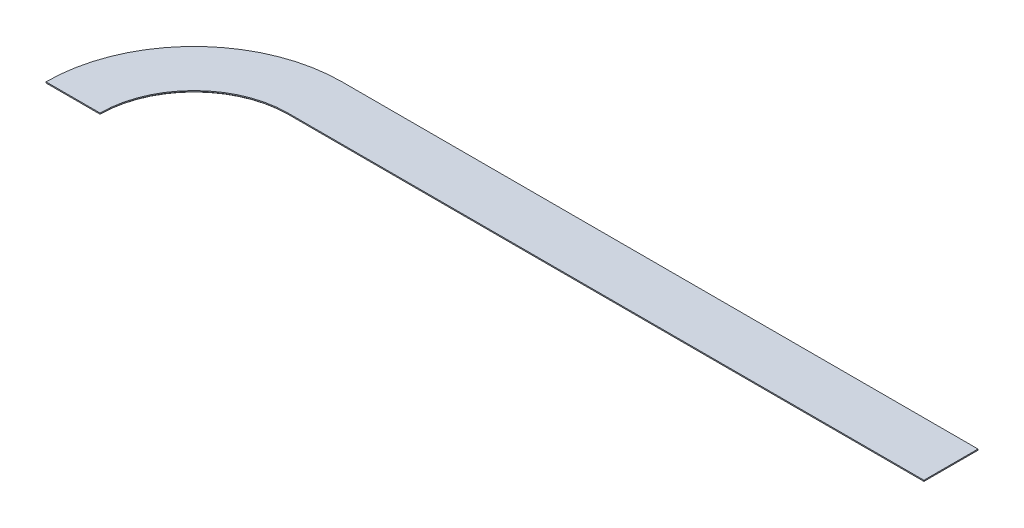
ISO-10303-21;
HEADER;
FILE_DESCRIPTION(('STEP AP214'),'2;1');
FILE_NAME('part.step','',(''),(''),'','','');
FILE_SCHEMA(('AUTOMOTIVE_DESIGN { 1 0 10303 214 1 1 1 1 }'));
ENDSEC;
DATA;
#1=APPLICATION_CONTEXT('core data for automotive mechanical design processes');
#2=APPLICATION_PROTOCOL_DEFINITION('international standard','automotive_design',2000,#1);
#3=PRODUCT_CONTEXT('',#1,'mechanical');
#4=PRODUCT('Part','Part','',(#3));
#5=PRODUCT_RELATED_PRODUCT_CATEGORY('part','',(#4));
#6=PRODUCT_DEFINITION_FORMATION('','',#4);
#7=PRODUCT_DEFINITION_CONTEXT('part definition',#1,'design');
#8=PRODUCT_DEFINITION('design','',#6,#7);
#9=PRODUCT_DEFINITION_SHAPE('','',#8);
#10=(LENGTH_UNIT() NAMED_UNIT(*) SI_UNIT(.MILLI.,.METRE.));
#11=(NAMED_UNIT(*) PLANE_ANGLE_UNIT() SI_UNIT($,.RADIAN.));
#12=(NAMED_UNIT(*) SI_UNIT($,.STERADIAN.) SOLID_ANGLE_UNIT());
#13=UNCERTAINTY_MEASURE_WITH_UNIT(LENGTH_MEASURE(1.E-05),#10,'distance_accuracy_value','');
#14=(GEOMETRIC_REPRESENTATION_CONTEXT(3) GLOBAL_UNCERTAINTY_ASSIGNED_CONTEXT((#13)) GLOBAL_UNIT_ASSIGNED_CONTEXT((#10,
#11,#12)) REPRESENTATION_CONTEXT('',''));
#15=CARTESIAN_POINT('',(0.,0.,0.));
#16=DIRECTION('',(0.,0.,1.));
#17=DIRECTION('',(1.,0.,0.));
#18=AXIS2_PLACEMENT_3D('',#15,#16,#17);
#19=CARTESIAN_POINT('',(-260.,-1088.5,1915.));
#20=DIRECTION('',(0.,-1.,0.));
#21=DIRECTION('',(0.,0.,1.));
#22=AXIS2_PLACEMENT_3D('',#19,#20,#21);
#23=PLANE('',#22);
#24=DIRECTION('',(-1.,7.842116600946E-11,-7.84208623432E-11));
#25=VECTOR('',#24,1.);
#26=CARTESIAN_POINT('',(688.3,-1088.5,830.3));
#27=LINE('',#26,#25);
#28=CARTESIAN_POINT('',(688.3,-1088.5,830.3));
#29=VERTEX_POINT('',#28);
#30=CARTESIAN_POINT('',(-76.,-1088.5,830.29999964));
#31=VERTEX_POINT('',#30);
#32=EDGE_CURVE('E11',#29,#31,#27,.T.);
#33=ORIENTED_EDGE('',*,*,#32,.T.);
#34=CARTESIAN_POINT('',(-76.,-1088.5,944.));
#35=DIRECTION('',(0.,1.,0.));
#36=DIRECTION('',(0.,0.,-1.));
#37=AXIS2_PLACEMENT_3D('',#34,#35,#36);
#38=CIRCLE('',#37,113.7000003596);
#39=CARTESIAN_POINT('',(-189.69784554588,-1088.5,943.2999999989));
#40=VERTEX_POINT('',#39);
#41=EDGE_CURVE('E27',#31,#40,#38,.T.);
#42=ORIENTED_EDGE('',*,*,#41,.T.);
#43=DIRECTION('',(-1.,6.131596345888E-09,3.37320483520896E-11));
#44=VECTOR('',#43,1.);
#45=CARTESIAN_POINT('',(-189.69784530615,-1088.49999994006,943.2999999996));
#46=LINE('',#45,#44);
#47=CARTESIAN_POINT('',(-253.298617256059,-1088.49999955009,943.3000000018));
#48=VERTEX_POINT('',#47);
#49=EDGE_CURVE('E93',#40,#48,#46,.T.);
#50=ORIENTED_EDGE('',*,*,#49,.T.);
#51=CARTESIAN_POINT('',(-76.,-1088.5,944.));
#52=DIRECTION('',(0.,-1.,0.));
#53=DIRECTION('',(-0.999992206181064,0.,-0.00394811057703186));
#54=AXIS2_PLACEMENT_3D('',#51,#52,#53);
#55=CIRCLE('',#54,177.2999973005);
#56=CARTESIAN_POINT('',(-75.9999999999,-1088.49999955009,766.70000045));
#57=VERTEX_POINT('',#56);
#58=EDGE_CURVE('E84',#48,#57,#55,.T.);
#59=ORIENTED_EDGE('',*,*,#58,.T.);
#60=DIRECTION('',(1.,-5.886522143537E-10,-5.88652685408E-10));
#61=VECTOR('',#60,1.);
#62=CARTESIAN_POINT('',(-75.9999999999,-1088.49999955009,766.70000045));
#63=LINE('',#62,#61);
#64=CARTESIAN_POINT('',(688.3,-1088.5,766.7));
#65=VERTEX_POINT('',#64);
#66=EDGE_CURVE('E78',#57,#65,#63,.T.);
#67=ORIENTED_EDGE('',*,*,#66,.T.);
#68=DIRECTION('',(0.,0.,1.));
#69=VECTOR('',#68,1.);
#70=CARTESIAN_POINT('',(688.3,-1088.5,766.7));
#71=LINE('',#70,#69);
#72=EDGE_CURVE('E112',#65,#29,#71,.T.);
#73=ORIENTED_EDGE('',*,*,#72,.T.);
#74=EDGE_LOOP('',(#33,#42,#50,#59,#67,#73));
#75=FACE_BOUND('',#74,.T.);
#76=ADVANCED_FACE('F17',(#75),#23,.T.);
#77=CARTESIAN_POINT('',(688.65,-1088.15,798.5));
#78=DIRECTION('',(0.707106781186498,-0.707106781186598,0.));
#79=DIRECTION('',(0.,0.,-1.));
#80=AXIS2_PLACEMENT_3D('',#77,#78,#79);
#81=PLANE('',#80);
#82=DIRECTION('',(-0.577350269189493,-0.577350269189493,0.577350269189892));
#83=VECTOR('',#82,1.);
#84=CARTESIAN_POINT('',(689.,-1087.8,766.));
#85=LINE('',#84,#83);
#86=CARTESIAN_POINT('',(689.,-1087.8,766.));
#87=VERTEX_POINT('',#86);
#88=EDGE_CURVE('E114',#87,#65,#85,.T.);
#89=ORIENTED_EDGE('',*,*,#88,.F.);
#90=DIRECTION('',(0.,0.,1.));
#91=VECTOR('',#90,1.);
#92=CARTESIAN_POINT('',(689.,-1087.8,766.));
#93=LINE('',#92,#91);
#94=CARTESIAN_POINT('',(689.,-1087.8,831.));
#95=VERTEX_POINT('',#94);
#96=EDGE_CURVE('E21',#87,#95,#93,.T.);
#97=ORIENTED_EDGE('',*,*,#96,.T.);
#98=DIRECTION('',(-0.577350269189693,-0.577350269189693,-0.577350269189492));
#99=VECTOR('',#98,1.);
#100=CARTESIAN_POINT('',(689.,-1087.8,831.));
#101=LINE('',#100,#99);
#102=EDGE_CURVE('E128',#95,#29,#101,.T.);
#103=ORIENTED_EDGE('',*,*,#102,.T.);
#104=ORIENTED_EDGE('',*,*,#72,.F.);
#105=EDGE_LOOP('',(#89,#97,#103,#104));
#106=FACE_BOUND('',#105,.T.);
#107=ADVANCED_FACE('F207',(#106),#81,.T.);
#108=CARTESIAN_POINT('',(306.5,-1088.15,830.65));
#109=DIRECTION('',(0.,-0.707106781186598,0.707106781186498));
#110=DIRECTION('',(1.,0.,0.));
#111=AXIS2_PLACEMENT_3D('',#108,#109,#110);
#112=PLANE('',#111);
#113=ORIENTED_EDGE('',*,*,#102,.F.);
#114=DIRECTION('',(-1.,5.84002560182E-11,-5.839996257101E-11));
#115=VECTOR('',#114,1.);
#116=CARTESIAN_POINT('',(689.,-1087.8,831.));
#117=LINE('',#116,#115);
#118=CARTESIAN_POINT('',(-76.,-1087.7999996426,831.));
#119=VERTEX_POINT('',#118);
#120=EDGE_CURVE('E131',#95,#119,#117,.T.);
#121=ORIENTED_EDGE('',*,*,#120,.T.);
#122=DIRECTION('',(-6.06934940828998E-11,0.707106765770697,0.707106796602397));
#123=VECTOR('',#122,1.);
#124=CARTESIAN_POINT('',(-75.9999999998,-1088.49999994006,830.29999994));
#125=LINE('',#124,#123);
#126=EDGE_CURVE('E167',#31,#119,#125,.T.);
#127=ORIENTED_EDGE('',*,*,#126,.F.);
#128=ORIENTED_EDGE('',*,*,#32,.F.);
#129=EDGE_LOOP('',(#113,#121,#127,#128));
#130=FACE_BOUND('',#129,.T.);
#131=ADVANCED_FACE('F206',(#130),#112,.T.);
#132=CARTESIAN_POINT('',(-76.,-1088.14999982135,944.));
#133=DIRECTION('',(0.,-1.,0.));
#134=DIRECTION('',(1.,0.,0.));
#135=AXIS2_PLACEMENT_3D('',#132,#133,#134);
#136=CONICAL_SURFACE('',#135,113.3500001799,0.785398164978743);
#137=CARTESIAN_POINT('',(-189.00000004467,-1087.79999995532,944.));
#138=CARTESIAN_POINT('',(-189.07734823264,-1087.87734814304,943.9226518123));
#139=CARTESIAN_POINT('',(-189.23217213923,-1088.03233051541,943.7676694974));
#140=CARTESIAN_POINT('',(-189.46478494972,-1088.26566046592,943.5343395563));
#141=CARTESIAN_POINT('',(-189.62011625658,-1088.42179086558,943.3782090741));
#142=CARTESIAN_POINT('',(-189.69784530615,-1088.49999994006,943.2999999996));
#143=(BOUNDED_CURVE() B_SPLINE_CURVE(3,(#137,#138,#139,#140,#141,#142),.UNSPECIFIED.,.F.,
.F.) B_SPLINE_CURVE_WITH_KNOTS((4,1,1,4),(0.,0.3333333333333,0.6666666666667,1.),
.UNSPECIFIED.) CURVE() GEOMETRIC_REPRESENTATION_ITEM() RATIONAL_B_SPLINE_CURVE((1.,1.,1.,1.,1.,1.)) REPRESENTATION_ITEM(''));
#144=CARTESIAN_POINT('',(-189.,-1087.7999996426,944.));
#145=VERTEX_POINT('',#144);
#146=EDGE_CURVE('E138',#145,#40,#143,.T.);
#147=ORIENTED_EDGE('',*,*,#146,.T.);
#148=ORIENTED_EDGE('',*,*,#41,.F.);
#149=ORIENTED_EDGE('',*,*,#126,.T.);
#150=CARTESIAN_POINT('',(-76.,-1087.7999996426,944.));
#151=DIRECTION('',(0.,1.,0.));
#152=DIRECTION('',(0.,0.,-1.));
#153=AXIS2_PLACEMENT_3D('',#150,#151,#152);
#154=CIRCLE('',#153,113.);
#155=EDGE_CURVE('E49',#119,#145,#154,.T.);
#156=ORIENTED_EDGE('',*,*,#155,.T.);
#157=EDGE_LOOP('',(#147,#148,#149,#156));
#158=FACE_BOUND('',#157,.T.);
#159=ADVANCED_FACE('F215',(#158),#136,.F.);
#160=CARTESIAN_POINT('',(-76.,-1088.5,944.));
#161=DIRECTION('',(0.,-1.,0.));
#162=DIRECTION('',(1.,0.,0.));
#163=AXIS2_PLACEMENT_3D('',#160,#161,#162);
#164=CYLINDRICAL_SURFACE('',#163,113.);
#165=DIRECTION('',(-1.353747929547E-10,1.,3.43661329404277E-08));
#166=VECTOR('',#165,1.);
#167=CARTESIAN_POINT('',(-75.9999999998,-1087.79999995532,830.999999955));
#168=LINE('',#167,#166);
#169=CARTESIAN_POINT('',(-76.,-1086.5,831.));
#170=VERTEX_POINT('',#169);
#171=EDGE_CURVE('E141',#119,#170,#168,.T.);
#172=ORIENTED_EDGE('',*,*,#171,.T.);
#173=CARTESIAN_POINT('',(-76.,-1086.5,944.));
#174=DIRECTION('',(0.,1.,0.));
#175=DIRECTION('',(0.,0.,-1.));
#176=AXIS2_PLACEMENT_3D('',#173,#174,#175);
#177=CIRCLE('',#176,113.);
#178=CARTESIAN_POINT('',(-189.,-1086.5,944.));
#179=VERTEX_POINT('',#178);
#180=EDGE_CURVE('E139',#170,#179,#177,.T.);
#181=ORIENTED_EDGE('',*,*,#180,.T.);
#182=DIRECTION('',(3.436520383033E-08,1.,0.));
#183=VECTOR('',#182,1.);
#184=CARTESIAN_POINT('',(-189.00000004467,-1087.79999995532,944.));
#185=LINE('',#184,#183);
#186=EDGE_CURVE('E57',#145,#179,#185,.T.);
#187=ORIENTED_EDGE('',*,*,#186,.F.);
#188=ORIENTED_EDGE('',*,*,#155,.F.);
#189=EDGE_LOOP('',(#172,#181,#187,#188));
#190=FACE_BOUND('',#189,.T.);
#191=ADVANCED_FACE('F176',(#190),#164,.F.);
#192=CARTESIAN_POINT('',(-189.,-1088.5,944.));
#193=DIRECTION('',(0.,0.,1.));
#194=DIRECTION('',(0.,-1.,0.));
#195=AXIS2_PLACEMENT_3D('',#192,#193,#194);
#196=PLANE('',#195);
#197=ORIENTED_EDGE('',*,*,#186,.T.);
#198=DIRECTION('',(-1.,0.,0.));
#199=VECTOR('',#198,1.);
#200=CARTESIAN_POINT('',(-189.,-1086.5,944.));
#201=LINE('',#200,#199);
#202=CARTESIAN_POINT('',(-254.,-1086.5,944.));
#203=VERTEX_POINT('',#202);
#204=EDGE_CURVE('E102',#179,#203,#201,.T.);
#205=ORIENTED_EDGE('',*,*,#204,.T.);
#206=DIRECTION('',(-2.60588194709591E-07,0.999999999999966,0.));
#207=VECTOR('',#206,1.);
#208=CARTESIAN_POINT('',(-253.999999661235,-1087.79999966124,944.));
#209=LINE('',#208,#207);
#210=CARTESIAN_POINT('',(-253.999999661235,-1087.79999966124,944.));
#211=VERTEX_POINT('',#210);
#212=EDGE_CURVE('E162',#211,#203,#209,.T.);
#213=ORIENTED_EDGE('',*,*,#212,.F.);
#214=DIRECTION('',(-1.,4.52445473843E-09,0.));
#215=VECTOR('',#214,1.);
#216=CARTESIAN_POINT('',(-189.00000004467,-1087.79999995532,944.));
#217=LINE('',#216,#215);
#218=EDGE_CURVE('E101',#145,#211,#217,.T.);
#219=ORIENTED_EDGE('',*,*,#218,.F.);
#220=EDGE_LOOP('',(#197,#205,#213,#219));
#221=FACE_BOUND('',#220,.T.);
#222=ADVANCED_FACE('F192',(#221),#196,.T.);
#223=CARTESIAN_POINT('',(-221.4989159188,-1088.15,943.65));
#224=DIRECTION('',(0.,-0.707106781186598,0.707106781186498));
#225=DIRECTION('',(1.,0.,0.));
#226=AXIS2_PLACEMENT_3D('',#223,#224,#225);
#227=PLANE('',#226);
#228=CARTESIAN_POINT('',(-253.999999661235,-1087.79999966124,944.));
#229=CARTESIAN_POINT('',(-253.921947054783,-1087.87805226888,943.9219473924));
#230=CARTESIAN_POINT('',(-253.765920471539,-1088.03397337613,943.7660267222));
#231=CARTESIAN_POINT('',(-253.532127774385,-1088.26730539899,943.532694765));
#232=CARTESIAN_POINT('',(-253.376427496957,-1088.4224959074,943.3775036445));
#233=CARTESIAN_POINT('',(-253.298617256059,-1088.49999955009,943.3000000018));
#234=(BOUNDED_CURVE() B_SPLINE_CURVE(3,(#228,#229,#230,#231,#232,#233),.UNSPECIFIED.,.F.,
.F.) B_SPLINE_CURVE_WITH_KNOTS((4,1,1,4),(0.,0.3333333333333,0.6666666666667,1.),
.UNSPECIFIED.) CURVE() GEOMETRIC_REPRESENTATION_ITEM() RATIONAL_B_SPLINE_CURVE((1.,1.,1.,1.,1.,1.)) REPRESENTATION_ITEM(''));
#235=EDGE_CURVE('E89',#211,#48,#234,.T.);
#236=ORIENTED_EDGE('',*,*,#235,.T.);
#237=ORIENTED_EDGE('',*,*,#49,.F.);
#238=ORIENTED_EDGE('',*,*,#146,.F.);
#239=ORIENTED_EDGE('',*,*,#218,.T.);
#240=EDGE_LOOP('',(#236,#237,#238,#239));
#241=FACE_BOUND('',#240,.T.);
#242=ADVANCED_FACE('F99',(#241),#227,.T.);
#243=CARTESIAN_POINT('',(-76.,-1088.14999864469,944.));
#244=DIRECTION('',(0.,1.,0.));
#245=DIRECTION('',(1.,0.,0.));
#246=AXIS2_PLACEMENT_3D('',#243,#244,#245);
#247=CONICAL_SURFACE('',#246,177.6499986505,0.785398155784522);
#248=ORIENTED_EDGE('',*,*,#235,.F.);
#249=CARTESIAN_POINT('',(-76.,-1087.7999972899,944.));
#250=DIRECTION('',(0.,-1.,0.));
#251=DIRECTION('',(-1.,0.,0.));
#252=AXIS2_PLACEMENT_3D('',#249,#250,#251);
#253=CIRCLE('',#252,178.);
#254=CARTESIAN_POINT('',(-75.9999999999,-1087.79999966124,766.000000339));
#255=VERTEX_POINT('',#254);
#256=EDGE_CURVE('E106',#211,#255,#253,.T.);
#257=ORIENTED_EDGE('',*,*,#256,.T.);
#258=DIRECTION('',(-1.88339319386797E-11,0.707106668913489,-0.707106893459589));
#259=VECTOR('',#258,1.);
#260=CARTESIAN_POINT('',(-75.9999999999,-1088.49999955009,766.70000045));
#261=LINE('',#260,#259);
#262=EDGE_CURVE('E91',#57,#255,#261,.T.);
#263=ORIENTED_EDGE('',*,*,#262,.F.);
#264=ORIENTED_EDGE('',*,*,#58,.F.);
#265=EDGE_LOOP('',(#248,#257,#263,#264));
#266=FACE_BOUND('',#265,.T.);
#267=ADVANCED_FACE('F86',(#266),#247,.T.);
#268=CARTESIAN_POINT('',(306.5,-1088.15,766.35));
#269=DIRECTION('',(0.,-0.707106781186698,-0.707106781186398));
#270=DIRECTION('',(1.,0.,0.));
#271=AXIS2_PLACEMENT_3D('',#268,#269,#270);
#272=PLANE('',#271);
#273=ORIENTED_EDGE('',*,*,#88,.T.);
#274=ORIENTED_EDGE('',*,*,#66,.F.);
#275=ORIENTED_EDGE('',*,*,#262,.T.);
#276=DIRECTION('',(1.,-4.428266877371E-10,-4.42826728663E-10));
#277=VECTOR('',#276,1.);
#278=CARTESIAN_POINT('',(-75.9999999999,-1087.79999966124,766.000000339));
#279=LINE('',#278,#277);
#280=EDGE_CURVE('E125',#255,#87,#279,.T.);
#281=ORIENTED_EDGE('',*,*,#280,.T.);
#282=EDGE_LOOP('',(#273,#274,#275,#281));
#283=FACE_BOUND('',#282,.T.);
#284=ADVANCED_FACE('F234',(#283),#272,.T.);
#285=CARTESIAN_POINT('',(-76.,-1088.5,766.));
#286=DIRECTION('',(0.,0.,-1.));
#287=DIRECTION('',(1.,0.,0.));
#288=AXIS2_PLACEMENT_3D('',#285,#286,#287);
#289=PLANE('',#288);
#290=DIRECTION('',(-4.36382667739086E-11,0.999999999999966,-2.60586565987424E-07));
#291=VECTOR('',#290,1.);
#292=CARTESIAN_POINT('',(-75.9999999999,-1087.79999966124,766.000000339));
#293=LINE('',#292,#291);
#294=CARTESIAN_POINT('',(-76.,-1086.5,766.));
#295=VERTEX_POINT('',#294);
#296=EDGE_CURVE('E127',#255,#295,#293,.T.);
#297=ORIENTED_EDGE('',*,*,#296,.T.);
#298=DIRECTION('',(1.,0.,0.));
#299=VECTOR('',#298,1.);
#300=CARTESIAN_POINT('',(-76.,-1086.5,766.));
#301=LINE('',#300,#299);
#302=CARTESIAN_POINT('',(689.,-1086.5,766.));
#303=VERTEX_POINT('',#302);
#304=EDGE_CURVE('E135',#295,#303,#301,.T.);
#305=ORIENTED_EDGE('',*,*,#304,.T.);
#306=DIRECTION('',(0.,1.,0.));
#307=VECTOR('',#306,1.);
#308=CARTESIAN_POINT('',(689.,-1087.8,766.));
#309=LINE('',#308,#307);
#310=EDGE_CURVE('E132',#87,#303,#309,.T.);
#311=ORIENTED_EDGE('',*,*,#310,.F.);
#312=ORIENTED_EDGE('',*,*,#280,.F.);
#313=EDGE_LOOP('',(#297,#305,#311,#312));
#314=FACE_BOUND('',#313,.T.);
#315=ADVANCED_FACE('F194',(#314),#289,.T.);
#316=CARTESIAN_POINT('',(689.,-1088.5,766.));
#317=DIRECTION('',(1.,0.,0.));
#318=DIRECTION('',(0.,0.,-1.));
#319=AXIS2_PLACEMENT_3D('',#316,#317,#318);
#320=PLANE('',#319);
#321=ORIENTED_EDGE('',*,*,#310,.T.);
#322=DIRECTION('',(0.,0.,1.));
#323=VECTOR('',#322,1.);
#324=CARTESIAN_POINT('',(689.,-1086.5,766.));
#325=LINE('',#324,#323);
#326=CARTESIAN_POINT('',(689.,-1086.5,831.));
#327=VERTEX_POINT('',#326);
#328=EDGE_CURVE('E122',#303,#327,#325,.T.);
#329=ORIENTED_EDGE('',*,*,#328,.T.);
#330=DIRECTION('',(0.,1.,0.));
#331=VECTOR('',#330,1.);
#332=CARTESIAN_POINT('',(689.,-1087.8,831.));
#333=LINE('',#332,#331);
#334=EDGE_CURVE('E120',#95,#327,#333,.T.);
#335=ORIENTED_EDGE('',*,*,#334,.F.);
#336=ORIENTED_EDGE('',*,*,#96,.F.);
#337=EDGE_LOOP('',(#321,#329,#335,#336));
#338=FACE_BOUND('',#337,.T.);
#339=ADVANCED_FACE('F197',(#338),#320,.T.);
#340=CARTESIAN_POINT('',(689.,-1088.5,831.));
#341=DIRECTION('',(0.,0.,1.));
#342=DIRECTION('',(0.,-1.,0.));
#343=AXIS2_PLACEMENT_3D('',#340,#341,#342);
#344=PLANE('',#343);
#345=ORIENTED_EDGE('',*,*,#334,.T.);
#346=DIRECTION('',(-1.,0.,0.));
#347=VECTOR('',#346,1.);
#348=CARTESIAN_POINT('',(689.,-1086.5,831.));
#349=LINE('',#348,#347);
#350=EDGE_CURVE('E123',#327,#170,#349,.T.);
#351=ORIENTED_EDGE('',*,*,#350,.T.);
#352=ORIENTED_EDGE('',*,*,#171,.F.);
#353=ORIENTED_EDGE('',*,*,#120,.F.);
#354=EDGE_LOOP('',(#345,#351,#352,#353));
#355=FACE_BOUND('',#354,.T.);
#356=ADVANCED_FACE('F180',(#355),#344,.T.);
#357=CARTESIAN_POINT('',(-260.,-1086.5,1915.));
#358=DIRECTION('',(0.,-1.,0.));
#359=DIRECTION('',(0.,0.,1.));
#360=AXIS2_PLACEMENT_3D('',#357,#358,#359);
#361=PLANE('',#360);
#362=ORIENTED_EDGE('',*,*,#350,.F.);
#363=ORIENTED_EDGE('',*,*,#328,.F.);
#364=ORIENTED_EDGE('',*,*,#304,.F.);
#365=CARTESIAN_POINT('',(-76.,-1086.5,944.));
#366=DIRECTION('',(0.,-1.,0.));
#367=DIRECTION('',(-1.,0.,0.));
#368=AXIS2_PLACEMENT_3D('',#365,#366,#367);
#369=CIRCLE('',#368,178.);
#370=EDGE_CURVE('E153',#203,#295,#369,.T.);
#371=ORIENTED_EDGE('',*,*,#370,.F.);
#372=ORIENTED_EDGE('',*,*,#204,.F.);
#373=ORIENTED_EDGE('',*,*,#180,.F.);
#374=EDGE_LOOP('',(#362,#363,#364,#371,#372,#373));
#375=FACE_BOUND('',#374,.T.);
#376=ADVANCED_FACE('F185',(#375),#361,.F.);
#377=CARTESIAN_POINT('',(-76.,-1088.5,944.));
#378=DIRECTION('',(0.,-1.,0.));
#379=DIRECTION('',(1.,0.,0.));
#380=AXIS2_PLACEMENT_3D('',#377,#378,#379);
#381=CYLINDRICAL_SURFACE('',#380,178.);
#382=ORIENTED_EDGE('',*,*,#212,.T.);
#383=ORIENTED_EDGE('',*,*,#370,.T.);
#384=ORIENTED_EDGE('',*,*,#296,.F.);
#385=ORIENTED_EDGE('',*,*,#256,.F.);
#386=EDGE_LOOP('',(#382,#383,#384,#385));
#387=FACE_BOUND('',#386,.T.);
#388=ADVANCED_FACE('F19',(#387),#381,.T.);
#389=CLOSED_SHELL('',(#76,#107,#131,#159,#191,#222,#242,#267,#284,#315,#339,#356,#376,#388));
#390=MANIFOLD_SOLID_BREP('B1',#389);
#391=ADVANCED_BREP_SHAPE_REPRESENTATION('',(#18,#390),#14);
#392=SHAPE_DEFINITION_REPRESENTATION(#9,#391);
ENDSEC;
END-ISO-10303-21;
